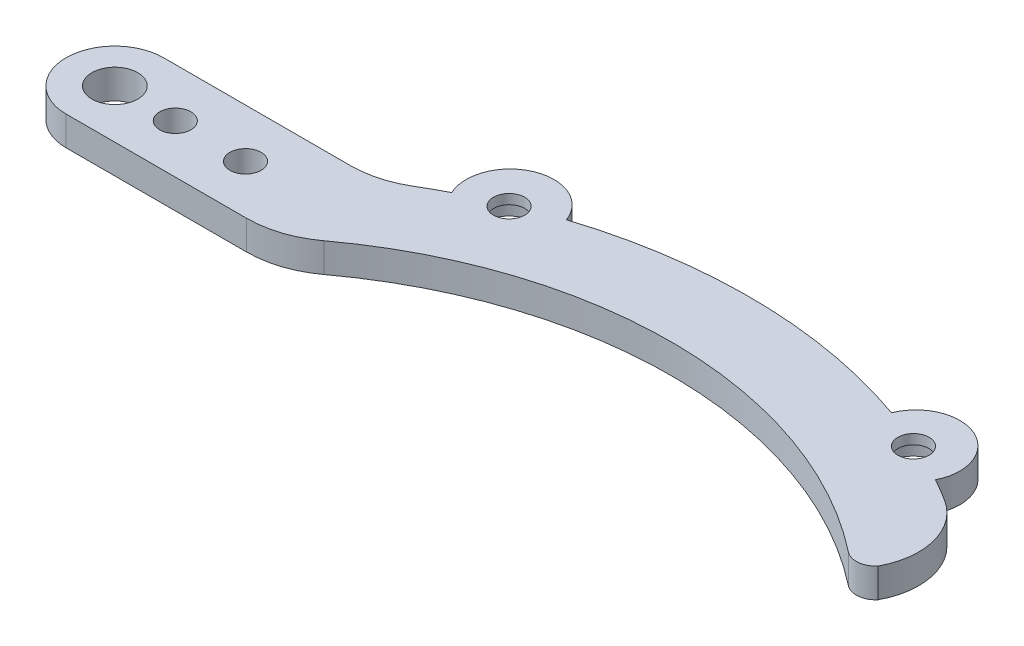
ISO-10303-21;
HEADER;
FILE_DESCRIPTION(('STEP AP214'),'2;1');
FILE_NAME('part.step','',(''),(''),'','','');
FILE_SCHEMA(('AUTOMOTIVE_DESIGN { 1 0 10303 214 1 1 1 1 }'));
ENDSEC;
DATA;
#1=APPLICATION_CONTEXT('core data for automotive mechanical design processes');
#2=APPLICATION_PROTOCOL_DEFINITION('international standard','automotive_design',2000,#1);
#3=PRODUCT_CONTEXT('',#1,'mechanical');
#4=PRODUCT('Part','Part','',(#3));
#5=PRODUCT_RELATED_PRODUCT_CATEGORY('part','',(#4));
#6=PRODUCT_DEFINITION_FORMATION('','',#4);
#7=PRODUCT_DEFINITION_CONTEXT('part definition',#1,'design');
#8=PRODUCT_DEFINITION('design','',#6,#7);
#9=PRODUCT_DEFINITION_SHAPE('','',#8);
#10=(LENGTH_UNIT() NAMED_UNIT(*) SI_UNIT(.MILLI.,.METRE.));
#11=(NAMED_UNIT(*) PLANE_ANGLE_UNIT() SI_UNIT($,.RADIAN.));
#12=(NAMED_UNIT(*) SI_UNIT($,.STERADIAN.) SOLID_ANGLE_UNIT());
#13=UNCERTAINTY_MEASURE_WITH_UNIT(LENGTH_MEASURE(1.E-05),#10,'distance_accuracy_value','');
#14=(GEOMETRIC_REPRESENTATION_CONTEXT(3) GLOBAL_UNCERTAINTY_ASSIGNED_CONTEXT((#13)) GLOBAL_UNIT_ASSIGNED_CONTEXT((#10,
#11,#12)) REPRESENTATION_CONTEXT('',''));
#15=CARTESIAN_POINT('',(0.,0.,0.));
#16=DIRECTION('',(0.,0.,1.));
#17=DIRECTION('',(1.,0.,0.));
#18=AXIS2_PLACEMENT_3D('',#15,#16,#17);
#19=CARTESIAN_POINT('',(1.89468168683699,-2.68774619760135,-1.21193832811461));
#20=DIRECTION('',(0.,1.,0.));
#21=DIRECTION('',(0.,0.,1.));
#22=AXIS2_PLACEMENT_3D('',#19,#20,#21);
#23=CYLINDRICAL_SURFACE('',#22,4.99999999999993);
#24=CARTESIAN_POINT('',(1.89468168683699,0.312253802398646,-1.21193832811461));
#25=DIRECTION('',(0.,-1.,0.));
#26=DIRECTION('',(0.,0.,-1.));
#27=AXIS2_PLACEMENT_3D('',#24,#25,#26);
#28=CIRCLE('',#27,4.99999999999993);
#29=CARTESIAN_POINT('',(1.89468168683699,0.312253802398646,-6.21193832811448));
#30=VERTEX_POINT('',#29);
#31=CARTESIAN_POINT('',(1.89468168683699,0.312253802398646,3.78806167188539));
#32=VERTEX_POINT('',#31);
#33=EDGE_CURVE('E141',#30,#32,#28,.F.);
#34=ORIENTED_EDGE('',*,*,#33,.F.);
#35=DIRECTION('',(0.,1.,0.));
#36=VECTOR('',#35,1.);
#37=CARTESIAN_POINT('',(1.89468168683699,-2.68774619760135,-6.21193832811448));
#38=LINE('',#37,#36);
#39=CARTESIAN_POINT('',(1.89468168683699,-2.68774619760135,-6.21193832811448));
#40=VERTEX_POINT('',#39);
#41=EDGE_CURVE('E135',#40,#30,#38,.T.);
#42=ORIENTED_EDGE('',*,*,#41,.F.);
#43=CARTESIAN_POINT('',(1.89468168683699,-2.68774619760135,-1.21193832811461));
#44=DIRECTION('',(0.,-1.,0.));
#45=DIRECTION('',(0.,0.,-1.));
#46=AXIS2_PLACEMENT_3D('',#43,#44,#45);
#47=CIRCLE('',#46,4.99999999999993);
#48=CARTESIAN_POINT('',(1.89468168683699,-2.68774619760135,3.78806167188539));
#49=VERTEX_POINT('',#48);
#50=EDGE_CURVE('E138',#40,#49,#47,.F.);
#51=ORIENTED_EDGE('',*,*,#50,.T.);
#52=DIRECTION('',(0.,1.,0.));
#53=VECTOR('',#52,1.);
#54=CARTESIAN_POINT('',(1.89468168683699,-2.68774619760135,3.78806167188539));
#55=LINE('',#54,#53);
#56=EDGE_CURVE('E204',#49,#32,#55,.T.);
#57=ORIENTED_EDGE('',*,*,#56,.T.);
#58=EDGE_LOOP('',(#34,#42,#51,#57));
#59=FACE_BOUND('',#58,.T.);
#60=ADVANCED_FACE('F41',(#59),#23,.T.);
#61=CARTESIAN_POINT('',(0.,-2.68774619760135,-6.21193832811448));
#62=DIRECTION('',(0.,0.,1.));
#63=DIRECTION('',(1.,0.,0.));
#64=AXIS2_PLACEMENT_3D('',#61,#62,#63);
#65=PLANE('',#64);
#66=DIRECTION('',(1.,0.,0.));
#67=VECTOR('',#66,1.);
#68=CARTESIAN_POINT('',(0.,0.312253802398646,-6.21193832811448));
#69=LINE('',#68,#67);
#70=CARTESIAN_POINT('',(21.026425844856,0.312253802398646,-6.21193832811447));
#71=VERTEX_POINT('',#70);
#72=EDGE_CURVE('E207',#30,#71,#69,.T.);
#73=ORIENTED_EDGE('',*,*,#72,.T.);
#74=DIRECTION('',(0.,1.,0.));
#75=VECTOR('',#74,1.);
#76=CARTESIAN_POINT('',(21.026425844856,-2.68774619760135,-6.21193832811447));
#77=LINE('',#76,#75);
#78=CARTESIAN_POINT('',(21.026425844856,-2.68774619760135,-6.21193832811447));
#79=VERTEX_POINT('',#78);
#80=EDGE_CURVE('E153',#71,#79,#77,.F.);
#81=ORIENTED_EDGE('',*,*,#80,.T.);
#82=DIRECTION('',(1.,0.,0.));
#83=VECTOR('',#82,1.);
#84=CARTESIAN_POINT('',(0.,-2.68774619760135,-6.21193832811448));
#85=LINE('',#84,#83);
#86=EDGE_CURVE('E150',#40,#79,#85,.T.);
#87=ORIENTED_EDGE('',*,*,#86,.F.);
#88=ORIENTED_EDGE('',*,*,#41,.T.);
#89=EDGE_LOOP('',(#73,#81,#87,#88));
#90=FACE_BOUND('',#89,.T.);
#91=ADVANCED_FACE('F151',(#90),#65,.F.);
#92=CARTESIAN_POINT('',(53.1412199435257,-2.68774619760135,37.988061671886));
#93=DIRECTION('',(0.,1.,0.));
#94=DIRECTION('',(0.,0.,1.));
#95=AXIS2_PLACEMENT_3D('',#92,#93,#94);
#96=CYLINDRICAL_SURFACE('',#95,53.);
#97=CARTESIAN_POINT('',(53.1412199435257,-2.68774619760135,37.988061671886));
#98=DIRECTION('',(0.,-1.,0.));
#99=DIRECTION('',(0.,0.,-1.));
#100=AXIS2_PLACEMENT_3D('',#97,#98,#99);
#101=CIRCLE('',#100,53.);
#102=CARTESIAN_POINT('',(28.6425882264622,-2.68774619760135,-9.00999194729797));
#103=VERTEX_POINT('',#102);
#104=CARTESIAN_POINT('',(26.1240122097243,-2.68774619760135,-7.6087637249398));
#105=VERTEX_POINT('',#104);
#106=EDGE_CURVE('E157',#103,#105,#101,.F.);
#107=ORIENTED_EDGE('',*,*,#106,.T.);
#108=DIRECTION('',(0.,1.,0.));
#109=VECTOR('',#108,1.);
#110=CARTESIAN_POINT('',(26.1240122097242,-2.68774619760135,-7.6087637249398));
#111=LINE('',#110,#109);
#112=CARTESIAN_POINT('',(26.1240122097243,0.312253802398646,-7.6087637249398));
#113=VERTEX_POINT('',#112);
#114=EDGE_CURVE('E146',#105,#113,#111,.T.);
#115=ORIENTED_EDGE('',*,*,#114,.T.);
#116=CARTESIAN_POINT('',(53.1412199435257,0.312253802398646,37.988061671886));
#117=DIRECTION('',(0.,-1.,0.));
#118=DIRECTION('',(0.,0.,-1.));
#119=AXIS2_PLACEMENT_3D('',#116,#117,#118);
#120=CIRCLE('',#119,53.);
#121=CARTESIAN_POINT('',(28.6425882264622,0.312253802398646,-9.00999194729797));
#122=VERTEX_POINT('',#121);
#123=EDGE_CURVE('E211',#122,#113,#120,.F.);
#124=ORIENTED_EDGE('',*,*,#123,.F.);
#125=DIRECTION('',(0.,1.,0.));
#126=VECTOR('',#125,1.);
#127=CARTESIAN_POINT('',(28.6425882264622,-2.68774619760135,-9.00999194729797));
#128=LINE('',#127,#126);
#129=EDGE_CURVE('E147',#103,#122,#128,.T.);
#130=ORIENTED_EDGE('',*,*,#129,.F.);
#131=EDGE_LOOP('',(#107,#115,#124,#130));
#132=FACE_BOUND('',#131,.T.);
#133=ADVANCED_FACE('F327',(#132),#96,.T.);
#134=CARTESIAN_POINT('',(32.7176965131315,-2.68774619760135,-10.9187854017921));
#135=DIRECTION('',(0.,1.,0.));
#136=DIRECTION('',(0.,0.,1.));
#137=AXIS2_PLACEMENT_3D('',#134,#135,#136);
#138=CYLINDRICAL_SURFACE('',#137,4.5);
#139=CARTESIAN_POINT('',(32.7176965131315,0.312253802398646,-10.9187854017921));
#140=DIRECTION('',(0.,-1.,0.));
#141=DIRECTION('',(0.,0.,-1.));
#142=AXIS2_PLACEMENT_3D('',#139,#140,#141);
#143=CIRCLE('',#142,4.5);
#144=CARTESIAN_POINT('',(36.9400373912801,0.312253802398646,-12.4750108060043));
#145=VERTEX_POINT('',#144);
#146=EDGE_CURVE('E215',#145,#122,#143,.F.);
#147=ORIENTED_EDGE('',*,*,#146,.F.);
#148=DIRECTION('',(0.,1.,0.));
#149=VECTOR('',#148,1.);
#150=CARTESIAN_POINT('',(36.9400373912801,-2.68774619760135,-12.4750108060043));
#151=LINE('',#150,#149);
#152=CARTESIAN_POINT('',(36.9400373912801,-2.68774619760135,-12.4750108060043));
#153=VERTEX_POINT('',#152);
#154=EDGE_CURVE('E248',#153,#145,#151,.T.);
#155=ORIENTED_EDGE('',*,*,#154,.F.);
#156=CARTESIAN_POINT('',(32.7176965131315,-2.68774619760135,-10.9187854017921));
#157=DIRECTION('',(0.,-1.,0.));
#158=DIRECTION('',(0.,0.,-1.));
#159=AXIS2_PLACEMENT_3D('',#156,#157,#158);
#160=CIRCLE('',#159,4.5);
#161=EDGE_CURVE('E177',#153,#103,#160,.F.);
#162=ORIENTED_EDGE('',*,*,#161,.T.);
#163=ORIENTED_EDGE('',*,*,#129,.T.);
#164=EDGE_LOOP('',(#147,#155,#162,#163));
#165=FACE_BOUND('',#164,.T.);
#166=ADVANCED_FACE('F308',(#165),#138,.T.);
#167=CARTESIAN_POINT('',(70.7450649674562,0.312253802398646,-12.0029839300359));
#168=VERTEX_POINT('',#167);
#169=EDGE_CURVE('E217',#168,#145,#120,.F.);
#170=ORIENTED_EDGE('',*,*,#169,.F.);
#171=DIRECTION('',(0.,1.,0.));
#172=VECTOR('',#171,1.);
#173=CARTESIAN_POINT('',(70.7450649674562,-2.68774619760135,-12.0029839300359));
#174=LINE('',#173,#172);
#175=CARTESIAN_POINT('',(70.7450649674562,-2.68774619760135,-12.0029839300359));
#176=VERTEX_POINT('',#175);
#177=EDGE_CURVE('E245',#176,#168,#174,.T.);
#178=ORIENTED_EDGE('',*,*,#177,.F.);
#179=EDGE_CURVE('E179',#176,#153,#101,.F.);
#180=ORIENTED_EDGE('',*,*,#179,.T.);
#181=ORIENTED_EDGE('',*,*,#154,.T.);
#182=EDGE_LOOP('',(#170,#178,#180,#181));
#183=FACE_BOUND('',#182,.T.);
#184=ADVANCED_FACE('F301',(#183),#96,.T.);
#185=CARTESIAN_POINT('',(74.922308346537,-2.68774619760135,-10.3294733229812));
#186=DIRECTION('',(0.,1.,0.));
#187=DIRECTION('',(0.,0.,1.));
#188=AXIS2_PLACEMENT_3D('',#185,#186,#187);
#189=CYLINDRICAL_SURFACE('',#188,4.5);
#190=CARTESIAN_POINT('',(74.922308346537,0.312253802398646,-10.3294733229812));
#191=DIRECTION('',(0.,-1.,0.));
#192=DIRECTION('',(0.,0.,-1.));
#193=AXIS2_PLACEMENT_3D('',#190,#191,#192);
#194=CIRCLE('',#193,4.5);
#195=CARTESIAN_POINT('',(78.9425324873975,0.312253802398646,-8.30764299942714));
#196=VERTEX_POINT('',#195);
#197=EDGE_CURVE('E221',#168,#196,#194,.T.);
#198=ORIENTED_EDGE('',*,*,#197,.T.);
#199=DIRECTION('',(0.,1.,0.));
#200=VECTOR('',#199,1.);
#201=CARTESIAN_POINT('',(78.9425324873975,-2.68774619760135,-8.30764299942714));
#202=LINE('',#201,#200);
#203=CARTESIAN_POINT('',(78.9425324873975,-2.68774619760135,-8.30764299942714));
#204=VERTEX_POINT('',#203);
#205=EDGE_CURVE('E241',#204,#196,#202,.T.);
#206=ORIENTED_EDGE('',*,*,#205,.F.);
#207=CARTESIAN_POINT('',(74.922308346537,-2.68774619760135,-10.3294733229812));
#208=DIRECTION('',(0.,-1.,0.));
#209=DIRECTION('',(0.,0.,-1.));
#210=AXIS2_PLACEMENT_3D('',#207,#208,#209);
#211=CIRCLE('',#210,4.5);
#212=EDGE_CURVE('E183',#176,#204,#211,.T.);
#213=ORIENTED_EDGE('',*,*,#212,.F.);
#214=ORIENTED_EDGE('',*,*,#177,.T.);
#215=EDGE_LOOP('',(#198,#206,#213,#214));
#216=FACE_BOUND('',#215,.T.);
#217=ADVANCED_FACE('F318',(#216),#189,.T.);
#218=CARTESIAN_POINT('',(81.2107590333428,0.312253802398646,-6.96859495741896));
#219=VERTEX_POINT('',#218);
#220=EDGE_CURVE('E216',#219,#196,#120,.F.);
#221=ORIENTED_EDGE('',*,*,#220,.F.);
#222=DIRECTION('',(0.,1.,0.));
#223=VECTOR('',#222,1.);
#224=CARTESIAN_POINT('',(81.2107590333428,-2.68774619760135,-6.96859495741896));
#225=LINE('',#224,#223);
#226=CARTESIAN_POINT('',(81.2107590333428,-2.68774619760135,-6.96859495741896));
#227=VERTEX_POINT('',#226);
#228=EDGE_CURVE('E50',#219,#227,#225,.F.);
#229=ORIENTED_EDGE('',*,*,#228,.T.);
#230=EDGE_CURVE('E178',#227,#204,#101,.F.);
#231=ORIENTED_EDGE('',*,*,#230,.T.);
#232=ORIENTED_EDGE('',*,*,#205,.T.);
#233=EDGE_LOOP('',(#221,#229,#231,#232));
#234=FACE_BOUND('',#233,.T.);
#235=ADVANCED_FACE('F316',(#234),#96,.T.);
#236=CARTESIAN_POINT('',(53.1412199435257,-2.68774619760135,37.988061671886));
#237=DIRECTION('',(0.,1.,0.));
#238=DIRECTION('',(0.,0.,1.));
#239=AXIS2_PLACEMENT_3D('',#236,#237,#238);
#240=CYLINDRICAL_SURFACE('',#239,45.);
#241=CARTESIAN_POINT('',(53.1412199435257,-2.68774619760135,37.988061671886));
#242=DIRECTION('',(0.,-1.,0.));
#243=DIRECTION('',(0.,0.,-1.));
#244=AXIS2_PLACEMENT_3D('',#241,#242,#243);
#245=CIRCLE('',#244,45.);
#246=CARTESIAN_POINT('',(80.9059476162616,-2.68774619760135,2.57450639627421));
#247=VERTEX_POINT('',#246);
#248=CARTESIAN_POINT('',(26.3607904294451,-2.68774619760135,1.82442530824914));
#249=VERTEX_POINT('',#248);
#250=EDGE_CURVE('E187',#247,#249,#245,.F.);
#251=ORIENTED_EDGE('',*,*,#250,.F.);
#252=DIRECTION('',(0.,1.,0.));
#253=VECTOR('',#252,1.);
#254=CARTESIAN_POINT('',(80.9059476162616,-2.68774619760135,2.5745063962742));
#255=LINE('',#254,#253);
#256=CARTESIAN_POINT('',(80.9059476162616,0.312253802398646,2.57450639627421));
#257=VERTEX_POINT('',#256);
#258=EDGE_CURVE('E279',#247,#257,#255,.T.);
#259=ORIENTED_EDGE('',*,*,#258,.T.);
#260=CARTESIAN_POINT('',(53.1412199435257,0.312253802398646,37.988061671886));
#261=DIRECTION('',(0.,-1.,0.));
#262=DIRECTION('',(0.,0.,-1.));
#263=AXIS2_PLACEMENT_3D('',#260,#261,#262);
#264=CIRCLE('',#263,45.);
#265=CARTESIAN_POINT('',(26.3607904294451,0.312253802398646,1.82442530824914));
#266=VERTEX_POINT('',#265);
#267=EDGE_CURVE('E225',#257,#266,#264,.F.);
#268=ORIENTED_EDGE('',*,*,#267,.T.);
#269=DIRECTION('',(0.,1.,0.));
#270=VECTOR('',#269,1.);
#271=CARTESIAN_POINT('',(26.3607904294451,-2.68774619760135,1.82442530824914));
#272=LINE('',#271,#270);
#273=EDGE_CURVE('E266',#266,#249,#272,.F.);
#274=ORIENTED_EDGE('',*,*,#273,.T.);
#275=EDGE_LOOP('',(#251,#259,#268,#274));
#276=FACE_BOUND('',#275,.T.);
#277=ADVANCED_FACE('F325',(#276),#240,.F.);
#278=CARTESIAN_POINT('',(8.09468168683698,-2.68774619760135,-1.21193832811456));
#279=DIRECTION('',(0.,1.,0.));
#280=DIRECTION('',(0.,0.,1.));
#281=AXIS2_PLACEMENT_3D('',#278,#279,#280);
#282=CYLINDRICAL_SURFACE('',#281,1.6);
#283=CARTESIAN_POINT('',(8.09468168683698,-2.68774619760135,-1.21193832811456));
#284=DIRECTION('',(0.,-1.,0.));
#285=DIRECTION('',(0.,0.,-1.));
#286=AXIS2_PLACEMENT_3D('',#283,#284,#285);
#287=CIRCLE('',#286,1.6);
#288=CARTESIAN_POINT('',(8.09468168683698,-2.68774619760135,-2.81193832811456));
#289=VERTEX_POINT('',#288);
#290=EDGE_CURVE('E196',#289,#289,#287,.T.);
#291=ORIENTED_EDGE('',*,*,#290,.T.);
#292=EDGE_LOOP('',(#291));
#293=FACE_BOUND('',#292,.T.);
#294=CARTESIAN_POINT('',(8.09468168683698,0.312253802398646,-1.21193832811456));
#295=DIRECTION('',(0.,-1.,0.));
#296=DIRECTION('',(0.,0.,-1.));
#297=AXIS2_PLACEMENT_3D('',#294,#295,#296);
#298=CIRCLE('',#297,1.6);
#299=CARTESIAN_POINT('',(8.09468168683698,0.312253802398646,-2.81193832811456));
#300=VERTEX_POINT('',#299);
#301=EDGE_CURVE('E168',#300,#300,#298,.T.);
#302=ORIENTED_EDGE('',*,*,#301,.F.);
#303=EDGE_LOOP('',(#302));
#304=FACE_BOUND('',#303,.T.);
#305=ADVANCED_FACE('F378',(#293,#304),#282,.F.);
#306=CARTESIAN_POINT('',(15.294681686837,-2.68774619760135,-1.21193832811461));
#307=DIRECTION('',(0.,1.,0.));
#308=DIRECTION('',(0.,0.,1.));
#309=AXIS2_PLACEMENT_3D('',#306,#307,#308);
#310=CYLINDRICAL_SURFACE('',#309,1.6);
#311=CARTESIAN_POINT('',(15.294681686837,-2.68774619760135,-1.21193832811461));
#312=DIRECTION('',(0.,-1.,0.));
#313=DIRECTION('',(0.,0.,-1.));
#314=AXIS2_PLACEMENT_3D('',#311,#312,#313);
#315=CIRCLE('',#314,1.6);
#316=CARTESIAN_POINT('',(15.294681686837,-2.68774619760135,-2.81193832811461));
#317=VERTEX_POINT('',#316);
#318=EDGE_CURVE('E192',#317,#317,#315,.T.);
#319=ORIENTED_EDGE('',*,*,#318,.T.);
#320=EDGE_LOOP('',(#319));
#321=FACE_BOUND('',#320,.T.);
#322=CARTESIAN_POINT('',(15.294681686837,0.312253802398646,-1.21193832811461));
#323=DIRECTION('',(0.,-1.,0.));
#324=DIRECTION('',(0.,0.,-1.));
#325=AXIS2_PLACEMENT_3D('',#322,#323,#324);
#326=CIRCLE('',#325,1.6);
#327=CARTESIAN_POINT('',(15.294681686837,0.312253802398646,-2.81193832811461));
#328=VERTEX_POINT('',#327);
#329=EDGE_CURVE('E232',#328,#328,#326,.T.);
#330=ORIENTED_EDGE('',*,*,#329,.F.);
#331=EDGE_LOOP('',(#330));
#332=FACE_BOUND('',#331,.T.);
#333=ADVANCED_FACE('F382',(#321,#332),#310,.F.);
#334=CARTESIAN_POINT('',(0.,-2.68774619760135,3.78806167188539));
#335=DIRECTION('',(0.,0.,1.));
#336=DIRECTION('',(1.,0.,0.));
#337=AXIS2_PLACEMENT_3D('',#334,#335,#336);
#338=PLANE('',#337);
#339=DIRECTION('',(1.,0.,0.));
#340=VECTOR('',#339,1.);
#341=CARTESIAN_POINT('',(0.,-2.68774619760135,3.78806167188539));
#342=LINE('',#341,#340);
#343=CARTESIAN_POINT('',(20.4095838707605,-2.68774619760135,3.78806167188539));
#344=VERTEX_POINT('',#343);
#345=EDGE_CURVE('E162',#49,#344,#342,.T.);
#346=ORIENTED_EDGE('',*,*,#345,.T.);
#347=DIRECTION('',(0.,-1.,0.));
#348=VECTOR('',#347,1.);
#349=CARTESIAN_POINT('',(20.4095838707605,0.312253802398646,3.78806167188539));
#350=LINE('',#349,#348);
#351=CARTESIAN_POINT('',(20.4095838707605,0.312253802398646,3.78806167188539));
#352=VERTEX_POINT('',#351);
#353=EDGE_CURVE('E258',#344,#352,#350,.F.);
#354=ORIENTED_EDGE('',*,*,#353,.T.);
#355=DIRECTION('',(1.,0.,0.));
#356=VECTOR('',#355,1.);
#357=CARTESIAN_POINT('',(0.,0.312253802398646,3.78806167188539));
#358=LINE('',#357,#356);
#359=EDGE_CURVE('E228',#32,#352,#358,.T.);
#360=ORIENTED_EDGE('',*,*,#359,.F.);
#361=ORIENTED_EDGE('',*,*,#56,.F.);
#362=EDGE_LOOP('',(#346,#354,#360,#361));
#363=FACE_BOUND('',#362,.T.);
#364=ADVANCED_FACE('F367',(#363),#338,.T.);
#365=CARTESIAN_POINT('',(1.89468168683699,-2.68774619760135,-1.21193832811461));
#366=DIRECTION('',(0.,1.,0.));
#367=DIRECTION('',(0.,0.,1.));
#368=AXIS2_PLACEMENT_3D('',#365,#366,#367);
#369=CYLINDRICAL_SURFACE('',#368,2.35);
#370=CARTESIAN_POINT('',(1.89468168683699,-2.68774619760135,-1.21193832811461));
#371=DIRECTION('',(0.,-1.,0.));
#372=DIRECTION('',(0.,0.,-1.));
#373=AXIS2_PLACEMENT_3D('',#370,#371,#372);
#374=CIRCLE('',#373,2.35);
#375=CARTESIAN_POINT('',(1.89468168683699,-2.68774619760135,-3.56193832811461));
#376=VERTEX_POINT('',#375);
#377=EDGE_CURVE('E200',#376,#376,#374,.F.);
#378=ORIENTED_EDGE('',*,*,#377,.F.);
#379=EDGE_LOOP('',(#378));
#380=FACE_BOUND('',#379,.T.);
#381=CARTESIAN_POINT('',(1.89468168683699,0.312253802398646,-1.21193832811461));
#382=DIRECTION('',(0.,-1.,0.));
#383=DIRECTION('',(0.,0.,-1.));
#384=AXIS2_PLACEMENT_3D('',#381,#382,#383);
#385=CIRCLE('',#384,2.35);
#386=CARTESIAN_POINT('',(1.89468168683699,0.312253802398646,-3.56193832811461));
#387=VERTEX_POINT('',#386);
#388=EDGE_CURVE('E164',#387,#387,#385,.F.);
#389=ORIENTED_EDGE('',*,*,#388,.T.);
#390=EDGE_LOOP('',(#389));
#391=FACE_BOUND('',#390,.T.);
#392=ADVANCED_FACE('F381',(#380,#391),#369,.F.);
#393=CARTESIAN_POINT('',(0.,-2.68774619760135,0.));
#394=DIRECTION('',(0.,-1.,0.));
#395=DIRECTION('',(0.,0.,-1.));
#396=AXIS2_PLACEMENT_3D('',#393,#394,#395);
#397=PLANE('',#396);
#398=CARTESIAN_POINT('',(32.7913128088712,-2.68774619760135,-10.7425013766511));
#399=DIRECTION('',(0.,-1.,0.));
#400=DIRECTION('',(0.,0.,-1.));
#401=AXIS2_PLACEMENT_3D('',#398,#399,#400);
#402=CIRCLE('',#401,3.);
#403=CARTESIAN_POINT('',(32.7913128088712,-2.68774619760135,-13.7425013766511));
#404=VERTEX_POINT('',#403);
#405=EDGE_CURVE('E425',#404,#404,#402,.T.);
#406=ORIENTED_EDGE('',*,*,#405,.F.);
#407=EDGE_LOOP('',(#406));
#408=FACE_BOUND('',#407,.T.);
#409=CARTESIAN_POINT('',(74.8437987274268,-2.68774619760135,-10.1553134647315));
#410=DIRECTION('',(0.,-1.,0.));
#411=DIRECTION('',(0.,0.,-1.));
#412=AXIS2_PLACEMENT_3D('',#409,#410,#411);
#413=CIRCLE('',#412,3.);
#414=CARTESIAN_POINT('',(74.8437987274268,-2.68774619760135,-13.1553134647315));
#415=VERTEX_POINT('',#414);
#416=EDGE_CURVE('E438',#415,#415,#413,.T.);
#417=ORIENTED_EDGE('',*,*,#416,.F.);
#418=EDGE_LOOP('',(#417));
#419=FACE_BOUND('',#418,.T.);
#420=ORIENTED_EDGE('',*,*,#230,.F.);
#421=CARTESIAN_POINT('',(77.5034614177066,-2.68774619760135,-1.03092332713339));
#422=DIRECTION('',(0.,-1.,0.));
#423=DIRECTION('',(0.,0.,-1.));
#424=AXIS2_PLACEMENT_3D('',#421,#422,#423);
#425=CIRCLE('',#424,7.);
#426=CARTESIAN_POINT('',(83.6599355128277,-2.68774619760135,2.30041675098872));
#427=VERTEX_POINT('',#426);
#428=EDGE_CURVE('E11',#227,#427,#425,.T.);
#429=ORIENTED_EDGE('',*,*,#428,.T.);
#430=CARTESIAN_POINT('',(82.1399355128277,-2.68774619760135,1.00057060624701));
#431=DIRECTION('',(0.,-1.,0.));
#432=DIRECTION('',(0.,0.,-1.));
#433=AXIS2_PLACEMENT_3D('',#430,#431,#432);
#434=CIRCLE('',#433,2.);
#435=EDGE_CURVE('E290',#427,#247,#434,.T.);
#436=ORIENTED_EDGE('',*,*,#435,.T.);
#437=ORIENTED_EDGE('',*,*,#250,.T.);
#438=CARTESIAN_POINT('',(20.4095838707605,-2.68774619760135,-6.21193832811461));
#439=DIRECTION('',(0.,-1.,0.));
#440=DIRECTION('',(0.,0.,-1.));
#441=AXIS2_PLACEMENT_3D('',#438,#439,#440);
#442=CIRCLE('',#441,10.);
#443=EDGE_CURVE('E270',#249,#344,#442,.T.);
#444=ORIENTED_EDGE('',*,*,#443,.T.);
#445=ORIENTED_EDGE('',*,*,#345,.F.);
#446=ORIENTED_EDGE('',*,*,#50,.F.);
#447=ORIENTED_EDGE('',*,*,#86,.T.);
#448=CARTESIAN_POINT('',(21.0264258448561,-2.68774619760135,-16.2119383281145));
#449=DIRECTION('',(0.,-1.,0.));
#450=DIRECTION('',(0.,0.,-1.));
#451=AXIS2_PLACEMENT_3D('',#448,#449,#450);
#452=CIRCLE('',#451,10.);
#453=EDGE_CURVE('E276',#79,#105,#452,.F.);
#454=ORIENTED_EDGE('',*,*,#453,.T.);
#455=ORIENTED_EDGE('',*,*,#106,.F.);
#456=ORIENTED_EDGE('',*,*,#161,.F.);
#457=ORIENTED_EDGE('',*,*,#179,.F.);
#458=ORIENTED_EDGE('',*,*,#212,.T.);
#459=EDGE_LOOP('',(#420,#429,#436,#437,#444,#445,#446,#447,#454,#455,#456,#457,#458));
#460=FACE_BOUND('',#459,.T.);
#461=ORIENTED_EDGE('',*,*,#318,.F.);
#462=EDGE_LOOP('',(#461));
#463=FACE_BOUND('',#462,.T.);
#464=ORIENTED_EDGE('',*,*,#290,.F.);
#465=EDGE_LOOP('',(#464));
#466=FACE_BOUND('',#465,.T.);
#467=ORIENTED_EDGE('',*,*,#377,.T.);
#468=EDGE_LOOP('',(#467));
#469=FACE_BOUND('',#468,.T.);
#470=ADVANCED_FACE('F159',(#408,#419,#460,#463,#466,#469),#397,.T.);
#471=CARTESIAN_POINT('',(0.,0.312253802398646,0.));
#472=DIRECTION('',(0.,-1.,0.));
#473=DIRECTION('',(0.,0.,-1.));
#474=AXIS2_PLACEMENT_3D('',#471,#472,#473);
#475=PLANE('',#474);
#476=CARTESIAN_POINT('',(32.7913128088712,0.312253802398646,-10.7425013766511));
#477=DIRECTION('',(0.,-1.,0.));
#478=DIRECTION('',(0.,0.,-1.));
#479=AXIS2_PLACEMENT_3D('',#476,#477,#478);
#480=CIRCLE('',#479,1.6);
#481=CARTESIAN_POINT('',(32.7913128088712,0.312253802398646,-12.3425013766511));
#482=VERTEX_POINT('',#481);
#483=EDGE_CURVE('E429',#482,#482,#480,.F.);
#484=ORIENTED_EDGE('',*,*,#483,.F.);
#485=EDGE_LOOP('',(#484));
#486=FACE_BOUND('',#485,.T.);
#487=CARTESIAN_POINT('',(74.8437987274268,0.312253802398646,-10.1553134647315));
#488=DIRECTION('',(0.,-1.,0.));
#489=DIRECTION('',(0.,0.,-1.));
#490=AXIS2_PLACEMENT_3D('',#487,#488,#489);
#491=CIRCLE('',#490,1.6);
#492=CARTESIAN_POINT('',(74.8437987274268,0.312253802398646,-11.7553134647315));
#493=VERTEX_POINT('',#492);
#494=EDGE_CURVE('E208',#493,#493,#491,.F.);
#495=ORIENTED_EDGE('',*,*,#494,.F.);
#496=EDGE_LOOP('',(#495));
#497=FACE_BOUND('',#496,.T.);
#498=CARTESIAN_POINT('',(82.1399355128277,0.312253802398646,1.00057060624701));
#499=DIRECTION('',(0.,-1.,0.));
#500=DIRECTION('',(0.,0.,-1.));
#501=AXIS2_PLACEMENT_3D('',#498,#499,#500);
#502=CIRCLE('',#501,2.);
#503=CARTESIAN_POINT('',(83.6599355128277,0.312253802398646,2.30041675098872));
#504=VERTEX_POINT('',#503);
#505=EDGE_CURVE('E283',#257,#504,#502,.F.);
#506=ORIENTED_EDGE('',*,*,#505,.T.);
#507=CARTESIAN_POINT('',(77.5034614177066,0.312253802398646,-1.03092332713339));
#508=DIRECTION('',(0.,-1.,0.));
#509=DIRECTION('',(0.,0.,-1.));
#510=AXIS2_PLACEMENT_3D('',#507,#508,#509);
#511=CIRCLE('',#510,7.);
#512=EDGE_CURVE('E64',#504,#219,#511,.F.);
#513=ORIENTED_EDGE('',*,*,#512,.T.);
#514=ORIENTED_EDGE('',*,*,#220,.T.);
#515=ORIENTED_EDGE('',*,*,#197,.F.);
#516=ORIENTED_EDGE('',*,*,#169,.T.);
#517=ORIENTED_EDGE('',*,*,#146,.T.);
#518=ORIENTED_EDGE('',*,*,#123,.T.);
#519=CARTESIAN_POINT('',(21.0264258448561,0.312253802398646,-16.2119383281145));
#520=DIRECTION('',(0.,-1.,0.));
#521=DIRECTION('',(0.,0.,-1.));
#522=AXIS2_PLACEMENT_3D('',#519,#520,#521);
#523=CIRCLE('',#522,10.);
#524=EDGE_CURVE('E273',#113,#71,#523,.T.);
#525=ORIENTED_EDGE('',*,*,#524,.T.);
#526=ORIENTED_EDGE('',*,*,#72,.F.);
#527=ORIENTED_EDGE('',*,*,#33,.T.);
#528=ORIENTED_EDGE('',*,*,#359,.T.);
#529=CARTESIAN_POINT('',(20.4095838707605,0.312253802398646,-6.21193832811461));
#530=DIRECTION('',(0.,-1.,0.));
#531=DIRECTION('',(0.,0.,-1.));
#532=AXIS2_PLACEMENT_3D('',#529,#530,#531);
#533=CIRCLE('',#532,10.);
#534=EDGE_CURVE('E262',#352,#266,#533,.F.);
#535=ORIENTED_EDGE('',*,*,#534,.T.);
#536=ORIENTED_EDGE('',*,*,#267,.F.);
#537=EDGE_LOOP('',(#506,#513,#514,#515,#516,#517,#518,#525,#526,#527,#528,#535,#536));
#538=FACE_BOUND('',#537,.T.);
#539=ORIENTED_EDGE('',*,*,#329,.T.);
#540=EDGE_LOOP('',(#539));
#541=FACE_BOUND('',#540,.T.);
#542=ORIENTED_EDGE('',*,*,#301,.T.);
#543=EDGE_LOOP('',(#542));
#544=FACE_BOUND('',#543,.T.);
#545=ORIENTED_EDGE('',*,*,#388,.F.);
#546=EDGE_LOOP('',(#545));
#547=FACE_BOUND('',#546,.T.);
#548=ADVANCED_FACE('F312',(#486,#497,#538,#541,#544,#547),#475,.F.);
#549=CARTESIAN_POINT('',(21.0264258448561,-2.68774619760135,-16.2119383281145));
#550=DIRECTION('',(0.,1.,0.));
#551=DIRECTION('',(0.,0.,1.));
#552=AXIS2_PLACEMENT_3D('',#549,#550,#551);
#553=CYLINDRICAL_SURFACE('',#552,10.);
#554=ORIENTED_EDGE('',*,*,#453,.F.);
#555=ORIENTED_EDGE('',*,*,#80,.F.);
#556=ORIENTED_EDGE('',*,*,#524,.F.);
#557=ORIENTED_EDGE('',*,*,#114,.F.);
#558=EDGE_LOOP('',(#554,#555,#556,#557));
#559=FACE_BOUND('',#558,.T.);
#560=ADVANCED_FACE('F336',(#559),#553,.F.);
#561=CARTESIAN_POINT('',(20.4095838707605,-2.68774619760135,-6.21193832811461));
#562=DIRECTION('',(0.,1.,0.));
#563=DIRECTION('',(0.,0.,1.));
#564=AXIS2_PLACEMENT_3D('',#561,#562,#563);
#565=CYLINDRICAL_SURFACE('',#564,10.);
#566=ORIENTED_EDGE('',*,*,#443,.F.);
#567=ORIENTED_EDGE('',*,*,#273,.F.);
#568=ORIENTED_EDGE('',*,*,#534,.F.);
#569=ORIENTED_EDGE('',*,*,#353,.F.);
#570=EDGE_LOOP('',(#566,#567,#568,#569));
#571=FACE_BOUND('',#570,.T.);
#572=ADVANCED_FACE('F339',(#571),#565,.T.);
#573=CARTESIAN_POINT('',(74.8437987274268,-2.68774619760135,-10.1553134647315));
#574=DIRECTION('',(0.,-1.,0.));
#575=DIRECTION('',(0.,0.,-1.));
#576=AXIS2_PLACEMENT_3D('',#573,#574,#575);
#577=CYLINDRICAL_SURFACE('',#576,1.6);
#578=ORIENTED_EDGE('',*,*,#494,.T.);
#579=EDGE_LOOP('',(#578));
#580=FACE_BOUND('',#579,.T.);
#581=CARTESIAN_POINT('',(74.8437987274268,-0.687746197601352,-10.1553134647315));
#582=DIRECTION('',(0.,-1.,0.));
#583=DIRECTION('',(0.,0.,-1.));
#584=AXIS2_PLACEMENT_3D('',#581,#582,#583);
#585=CIRCLE('',#584,1.6);
#586=CARTESIAN_POINT('',(74.8437987274268,-0.687746197601352,-11.7553134647315));
#587=VERTEX_POINT('',#586);
#588=EDGE_CURVE('E171',#587,#587,#585,.T.);
#589=ORIENTED_EDGE('',*,*,#588,.T.);
#590=EDGE_LOOP('',(#589));
#591=FACE_BOUND('',#590,.T.);
#592=ADVANCED_FACE('F342',(#580,#591),#577,.F.);
#593=CARTESIAN_POINT('',(76.4437987274268,-0.687746197601352,-10.1553134647315));
#594=DIRECTION('',(0.,1.,0.));
#595=DIRECTION('',(0.,0.,1.));
#596=AXIS2_PLACEMENT_3D('',#593,#594,#595);
#597=PLANE('',#596);
#598=ORIENTED_EDGE('',*,*,#588,.F.);
#599=EDGE_LOOP('',(#598));
#600=FACE_BOUND('',#599,.T.);
#601=CARTESIAN_POINT('',(74.8437987274268,-0.687746197601352,-10.1553134647315));
#602=DIRECTION('',(0.,-1.,0.));
#603=DIRECTION('',(0.,0.,-1.));
#604=AXIS2_PLACEMENT_3D('',#601,#602,#603);
#605=CIRCLE('',#604,3.);
#606=CARTESIAN_POINT('',(74.8437987274268,-0.687746197601352,-13.1553134647315));
#607=VERTEX_POINT('',#606);
#608=EDGE_CURVE('E441',#607,#607,#605,.T.);
#609=ORIENTED_EDGE('',*,*,#608,.T.);
#610=EDGE_LOOP('',(#609));
#611=FACE_BOUND('',#610,.T.);
#612=ADVANCED_FACE('F400',(#600,#611),#597,.F.);
#613=CARTESIAN_POINT('',(74.8437987274268,-2.68774619760135,-10.1553134647315));
#614=DIRECTION('',(0.,-1.,0.));
#615=DIRECTION('',(0.,0.,-1.));
#616=AXIS2_PLACEMENT_3D('',#613,#614,#615);
#617=CYLINDRICAL_SURFACE('',#616,3.);
#618=ORIENTED_EDGE('',*,*,#608,.F.);
#619=EDGE_LOOP('',(#618));
#620=FACE_BOUND('',#619,.T.);
#621=ORIENTED_EDGE('',*,*,#416,.T.);
#622=EDGE_LOOP('',(#621));
#623=FACE_BOUND('',#622,.T.);
#624=ADVANCED_FACE('F404',(#620,#623),#617,.F.);
#625=CARTESIAN_POINT('',(32.7913128088712,-2.68774619760135,-10.7425013766511));
#626=DIRECTION('',(0.,-1.,0.));
#627=DIRECTION('',(0.,0.,-1.));
#628=AXIS2_PLACEMENT_3D('',#625,#626,#627);
#629=CYLINDRICAL_SURFACE('',#628,1.6);
#630=ORIENTED_EDGE('',*,*,#483,.T.);
#631=EDGE_LOOP('',(#630));
#632=FACE_BOUND('',#631,.T.);
#633=CARTESIAN_POINT('',(32.7913128088712,-0.687746197601352,-10.7425013766511));
#634=DIRECTION('',(0.,-1.,0.));
#635=DIRECTION('',(0.,0.,-1.));
#636=AXIS2_PLACEMENT_3D('',#633,#634,#635);
#637=CIRCLE('',#636,1.6);
#638=CARTESIAN_POINT('',(32.7913128088712,-0.687746197601352,-12.3425013766511));
#639=VERTEX_POINT('',#638);
#640=EDGE_CURVE('E420',#639,#639,#637,.T.);
#641=ORIENTED_EDGE('',*,*,#640,.T.);
#642=EDGE_LOOP('',(#641));
#643=FACE_BOUND('',#642,.T.);
#644=ADVANCED_FACE('F408',(#632,#643),#629,.F.);
#645=CARTESIAN_POINT('',(34.3913128088711,-0.687746197601352,-10.7425013766511));
#646=DIRECTION('',(0.,1.,0.));
#647=DIRECTION('',(0.,0.,1.));
#648=AXIS2_PLACEMENT_3D('',#645,#646,#647);
#649=PLANE('',#648);
#650=ORIENTED_EDGE('',*,*,#640,.F.);
#651=EDGE_LOOP('',(#650));
#652=FACE_BOUND('',#651,.T.);
#653=CARTESIAN_POINT('',(32.7913128088712,-0.687746197601352,-10.7425013766511));
#654=DIRECTION('',(0.,-1.,0.));
#655=DIRECTION('',(0.,0.,-1.));
#656=AXIS2_PLACEMENT_3D('',#653,#654,#655);
#657=CIRCLE('',#656,3.);
#658=CARTESIAN_POINT('',(32.7913128088712,-0.687746197601352,-13.7425013766511));
#659=VERTEX_POINT('',#658);
#660=EDGE_CURVE('E423',#659,#659,#657,.T.);
#661=ORIENTED_EDGE('',*,*,#660,.T.);
#662=EDGE_LOOP('',(#661));
#663=FACE_BOUND('',#662,.T.);
#664=ADVANCED_FACE('F353',(#652,#663),#649,.F.);
#665=CARTESIAN_POINT('',(32.7913128088712,-2.68774619760135,-10.7425013766511));
#666=DIRECTION('',(0.,-1.,0.));
#667=DIRECTION('',(0.,0.,-1.));
#668=AXIS2_PLACEMENT_3D('',#665,#666,#667);
#669=CYLINDRICAL_SURFACE('',#668,3.);
#670=ORIENTED_EDGE('',*,*,#660,.F.);
#671=EDGE_LOOP('',(#670));
#672=FACE_BOUND('',#671,.T.);
#673=ORIENTED_EDGE('',*,*,#405,.T.);
#674=EDGE_LOOP('',(#673));
#675=FACE_BOUND('',#674,.T.);
#676=ADVANCED_FACE('F346',(#672,#675),#669,.F.);
#677=CARTESIAN_POINT('',(82.1399355128277,-2.68774619760135,1.00057060624701));
#678=DIRECTION('',(0.,1.,0.));
#679=DIRECTION('',(0.,0.,1.));
#680=AXIS2_PLACEMENT_3D('',#677,#678,#679);
#681=CYLINDRICAL_SURFACE('',#680,2.);
#682=ORIENTED_EDGE('',*,*,#435,.F.);
#683=DIRECTION('',(0.,-1.,0.));
#684=VECTOR('',#683,1.);
#685=CARTESIAN_POINT('',(83.6599355128277,-2.68774619760135,2.30041675098873));
#686=LINE('',#685,#684);
#687=EDGE_CURVE('E286',#504,#427,#686,.T.);
#688=ORIENTED_EDGE('',*,*,#687,.F.);
#689=ORIENTED_EDGE('',*,*,#505,.F.);
#690=ORIENTED_EDGE('',*,*,#258,.F.);
#691=EDGE_LOOP('',(#682,#688,#689,#690));
#692=FACE_BOUND('',#691,.T.);
#693=ADVANCED_FACE('F344',(#692),#681,.T.);
#694=CARTESIAN_POINT('',(77.5034614177066,-2.68774619760135,-1.03092332713339));
#695=DIRECTION('',(0.,-1.,0.));
#696=DIRECTION('',(0.,0.,-1.));
#697=AXIS2_PLACEMENT_3D('',#694,#695,#696);
#698=CYLINDRICAL_SURFACE('',#697,7.);
#699=ORIENTED_EDGE('',*,*,#428,.F.);
#700=ORIENTED_EDGE('',*,*,#228,.F.);
#701=ORIENTED_EDGE('',*,*,#512,.F.);
#702=ORIENTED_EDGE('',*,*,#687,.T.);
#703=EDGE_LOOP('',(#699,#700,#701,#702));
#704=FACE_BOUND('',#703,.T.);
#705=ADVANCED_FACE('F43',(#704),#698,.T.);
#706=CLOSED_SHELL('',(#60,#91,#133,#166,#184,#217,#235,#277,#305,#333,#364,#392,#470,#548,#560,
#572,#592,#612,#624,#644,#664,#676,#693,#705));
#707=MANIFOLD_SOLID_BREP('B2',#706);
#708=ADVANCED_BREP_SHAPE_REPRESENTATION('',(#18,#707),#14);
#709=SHAPE_DEFINITION_REPRESENTATION(#9,#708);
ENDSEC;
END-ISO-10303-21;
